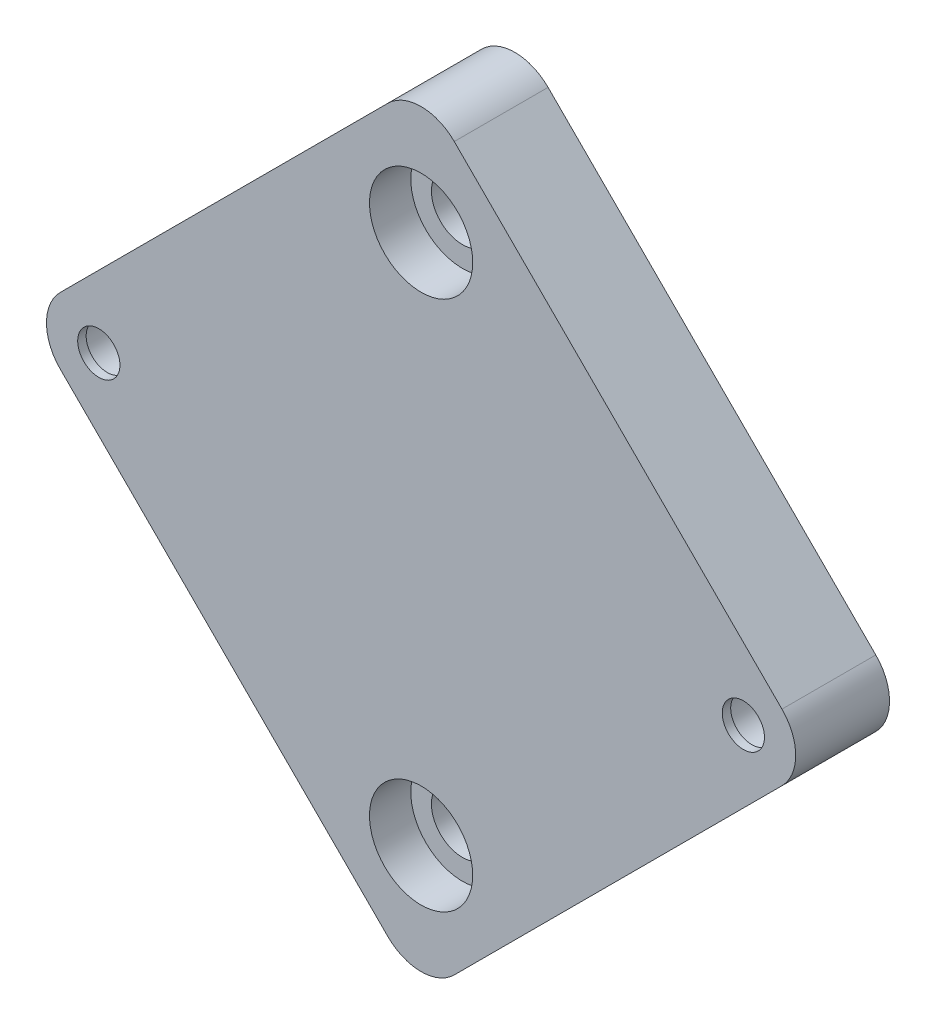
ISO-10303-21;
HEADER;
FILE_DESCRIPTION(('STEP AP214'),'2;1');
FILE_NAME('part.step','',(''),(''),'','','');
FILE_SCHEMA(('AUTOMOTIVE_DESIGN { 1 0 10303 214 1 1 1 1 }'));
ENDSEC;
DATA;
#1=APPLICATION_CONTEXT('core data for automotive mechanical design processes');
#2=APPLICATION_PROTOCOL_DEFINITION('international standard','automotive_design',2000,#1);
#3=PRODUCT_CONTEXT('',#1,'mechanical');
#4=PRODUCT('Part','Part','',(#3));
#5=PRODUCT_RELATED_PRODUCT_CATEGORY('part','',(#4));
#6=PRODUCT_DEFINITION_FORMATION('','',#4);
#7=PRODUCT_DEFINITION_CONTEXT('part definition',#1,'design');
#8=PRODUCT_DEFINITION('design','',#6,#7);
#9=PRODUCT_DEFINITION_SHAPE('','',#8);
#10=(LENGTH_UNIT() NAMED_UNIT(*) SI_UNIT(.MILLI.,.METRE.));
#11=(NAMED_UNIT(*) PLANE_ANGLE_UNIT() SI_UNIT($,.RADIAN.));
#12=(NAMED_UNIT(*) SI_UNIT($,.STERADIAN.) SOLID_ANGLE_UNIT());
#13=UNCERTAINTY_MEASURE_WITH_UNIT(LENGTH_MEASURE(1.E-05),#10,'distance_accuracy_value','');
#14=(GEOMETRIC_REPRESENTATION_CONTEXT(3) GLOBAL_UNCERTAINTY_ASSIGNED_CONTEXT((#13)) GLOBAL_UNIT_ASSIGNED_CONTEXT((#10,
#11,#12)) REPRESENTATION_CONTEXT('',''));
#15=CARTESIAN_POINT('',(0.,0.,0.));
#16=DIRECTION('',(0.,0.,1.));
#17=DIRECTION('',(1.,0.,0.));
#18=AXIS2_PLACEMENT_3D('',#15,#16,#17);
#19=CARTESIAN_POINT('',(0.,0.,10.));
#20=DIRECTION('',(0.,0.,1.));
#21=DIRECTION('',(1.,0.,0.));
#22=AXIS2_PLACEMENT_3D('',#19,#20,#21);
#23=PLANE('',#22);
#24=CARTESIAN_POINT('',(0.,28.2842712474619,10.));
#25=DIRECTION('',(0.,0.,1.));
#26=DIRECTION('',(1.,0.,0.));
#27=AXIS2_PLACEMENT_3D('',#24,#25,#26);
#28=CIRCLE('',#27,5.5);
#29=CARTESIAN_POINT('',(5.5,28.2842712474619,10.));
#30=VERTEX_POINT('',#29);
#31=EDGE_CURVE('E269',#30,#30,#28,.T.);
#32=ORIENTED_EDGE('',*,*,#31,.F.);
#33=EDGE_LOOP('',(#32));
#34=FACE_BOUND('',#33,.T.);
#35=CARTESIAN_POINT('',(0.,-28.2842712474619,10.));
#36=DIRECTION('',(0.,0.,1.));
#37=DIRECTION('',(1.,0.,0.));
#38=AXIS2_PLACEMENT_3D('',#35,#36,#37);
#39=CIRCLE('',#38,5.5);
#40=CARTESIAN_POINT('',(5.5,-28.2842712474619,10.));
#41=VERTEX_POINT('',#40);
#42=EDGE_CURVE('E253',#41,#41,#39,.T.);
#43=ORIENTED_EDGE('',*,*,#42,.F.);
#44=EDGE_LOOP('',(#43));
#45=FACE_BOUND('',#44,.T.);
#46=CARTESIAN_POINT('',(-34.35,0.,10.));
#47=DIRECTION('',(0.,0.,1.));
#48=DIRECTION('',(1.,0.,0.));
#49=AXIS2_PLACEMENT_3D('',#46,#47,#48);
#50=CIRCLE('',#49,2.25);
#51=CARTESIAN_POINT('',(-32.1,0.,10.));
#52=VERTEX_POINT('',#51);
#53=EDGE_CURVE('E142',#52,#52,#50,.T.);
#54=ORIENTED_EDGE('',*,*,#53,.F.);
#55=EDGE_LOOP('',(#54));
#56=FACE_BOUND('',#55,.T.);
#57=DIRECTION('',(0.707106781186547,-0.707106781186547,0.));
#58=VECTOR('',#57,1.);
#59=CARTESIAN_POINT('',(-42.,0.,10.));
#60=LINE('',#59,#58);
#61=CARTESIAN_POINT('',(-38.4644660940673,-3.53553390593274,10.));
#62=VERTEX_POINT('',#61);
#63=CARTESIAN_POINT('',(-3.53553390593276,-38.4644660940672,10.));
#64=VERTEX_POINT('',#63);
#65=EDGE_CURVE('E148',#62,#64,#60,.T.);
#66=ORIENTED_EDGE('',*,*,#65,.T.);
#67=CARTESIAN_POINT('',(0.,-34.9289321881345,10.));
#68=DIRECTION('',(0.,0.,1.));
#69=DIRECTION('',(1.,0.,0.));
#70=AXIS2_PLACEMENT_3D('',#67,#68,#69);
#71=CIRCLE('',#70,5.);
#72=CARTESIAN_POINT('',(3.53553390593273,-38.4644660940673,10.));
#73=VERTEX_POINT('',#72);
#74=EDGE_CURVE('E182',#64,#73,#71,.T.);
#75=ORIENTED_EDGE('',*,*,#74,.T.);
#76=DIRECTION('',(0.707106781186548,0.707106781186548,0.));
#77=VECTOR('',#76,1.);
#78=CARTESIAN_POINT('',(0.,-42.,10.));
#79=LINE('',#78,#77);
#80=CARTESIAN_POINT('',(38.4644660940673,-3.53553390593272,10.));
#81=VERTEX_POINT('',#80);
#82=EDGE_CURVE('E126',#73,#81,#79,.T.);
#83=ORIENTED_EDGE('',*,*,#82,.T.);
#84=CARTESIAN_POINT('',(34.9289321881345,0.,10.));
#85=DIRECTION('',(0.,0.,1.));
#86=DIRECTION('',(1.,0.,0.));
#87=AXIS2_PLACEMENT_3D('',#84,#85,#86);
#88=CIRCLE('',#87,5.);
#89=CARTESIAN_POINT('',(38.4644660940673,3.53553390593274,10.));
#90=VERTEX_POINT('',#89);
#91=EDGE_CURVE('E179',#81,#90,#88,.T.);
#92=ORIENTED_EDGE('',*,*,#91,.T.);
#93=DIRECTION('',(-0.707106781186548,0.707106781186548,0.));
#94=VECTOR('',#93,1.);
#95=CARTESIAN_POINT('',(0.,42.,10.));
#96=LINE('',#95,#94);
#97=CARTESIAN_POINT('',(3.53553390593274,38.4644660940673,10.));
#98=VERTEX_POINT('',#97);
#99=EDGE_CURVE('E208',#90,#98,#96,.T.);
#100=ORIENTED_EDGE('',*,*,#99,.T.);
#101=CARTESIAN_POINT('',(0.,34.9289321881345,10.));
#102=DIRECTION('',(0.,0.,1.));
#103=DIRECTION('',(1.,0.,0.));
#104=AXIS2_PLACEMENT_3D('',#101,#102,#103);
#105=CIRCLE('',#104,5.);
#106=CARTESIAN_POINT('',(-3.53553390593274,38.4644660940673,10.));
#107=VERTEX_POINT('',#106);
#108=EDGE_CURVE('E60',#98,#107,#105,.T.);
#109=ORIENTED_EDGE('',*,*,#108,.T.);
#110=DIRECTION('',(-0.707106781186548,-0.707106781186548,0.));
#111=VECTOR('',#110,1.);
#112=CARTESIAN_POINT('',(-42.,0.,10.));
#113=LINE('',#112,#111);
#114=CARTESIAN_POINT('',(-38.4644660940673,3.53553390593274,10.));
#115=VERTEX_POINT('',#114);
#116=EDGE_CURVE('E160',#107,#115,#113,.T.);
#117=ORIENTED_EDGE('',*,*,#116,.T.);
#118=CARTESIAN_POINT('',(-34.9289321881345,0.,10.));
#119=DIRECTION('',(0.,0.,1.));
#120=DIRECTION('',(1.,0.,0.));
#121=AXIS2_PLACEMENT_3D('',#118,#119,#120);
#122=CIRCLE('',#121,5.);
#123=EDGE_CURVE('E176',#115,#62,#122,.T.);
#124=ORIENTED_EDGE('',*,*,#123,.T.);
#125=EDGE_LOOP('',(#66,#75,#83,#92,#100,#109,#117,#124));
#126=FACE_BOUND('',#125,.T.);
#127=CARTESIAN_POINT('',(34.35,0.,10.));
#128=DIRECTION('',(0.,0.,1.));
#129=DIRECTION('',(1.,0.,0.));
#130=AXIS2_PLACEMENT_3D('',#127,#128,#129);
#131=CIRCLE('',#130,2.25);
#132=CARTESIAN_POINT('',(36.6,0.,10.));
#133=VERTEX_POINT('',#132);
#134=EDGE_CURVE('E158',#133,#133,#131,.T.);
#135=ORIENTED_EDGE('',*,*,#134,.F.);
#136=EDGE_LOOP('',(#135));
#137=FACE_BOUND('',#136,.T.);
#138=ADVANCED_FACE('F39',(#34,#45,#56,#126,#137),#23,.T.);
#139=CARTESIAN_POINT('',(0.,0.,0.));
#140=DIRECTION('',(0.,0.,1.));
#141=DIRECTION('',(1.,0.,0.));
#142=AXIS2_PLACEMENT_3D('',#139,#140,#141);
#143=PLANE('',#142);
#144=CARTESIAN_POINT('',(0.,28.2842712474619,0.));
#145=DIRECTION('',(0.,0.,1.));
#146=DIRECTION('',(1.,0.,0.));
#147=AXIS2_PLACEMENT_3D('',#144,#145,#146);
#148=CIRCLE('',#147,3.3);
#149=CARTESIAN_POINT('',(3.3,28.2842712474619,0.));
#150=VERTEX_POINT('',#149);
#151=EDGE_CURVE('E257',#150,#150,#148,.T.);
#152=ORIENTED_EDGE('',*,*,#151,.T.);
#153=EDGE_LOOP('',(#152));
#154=FACE_BOUND('',#153,.T.);
#155=CARTESIAN_POINT('',(0.,-28.2842712474619,0.));
#156=DIRECTION('',(0.,0.,1.));
#157=DIRECTION('',(1.,0.,0.));
#158=AXIS2_PLACEMENT_3D('',#155,#156,#157);
#159=CIRCLE('',#158,3.3);
#160=CARTESIAN_POINT('',(3.3,-28.2842712474619,0.));
#161=VERTEX_POINT('',#160);
#162=EDGE_CURVE('E231',#161,#161,#159,.T.);
#163=ORIENTED_EDGE('',*,*,#162,.T.);
#164=EDGE_LOOP('',(#163));
#165=FACE_BOUND('',#164,.T.);
#166=CARTESIAN_POINT('',(34.35,0.,0.));
#167=DIRECTION('',(0.,0.,1.));
#168=DIRECTION('',(1.,0.,0.));
#169=AXIS2_PLACEMENT_3D('',#166,#167,#168);
#170=CIRCLE('',#169,2.8);
#171=CARTESIAN_POINT('',(37.15,0.,0.));
#172=VERTEX_POINT('',#171);
#173=EDGE_CURVE('E235',#172,#172,#170,.T.);
#174=ORIENTED_EDGE('',*,*,#173,.T.);
#175=EDGE_LOOP('',(#174));
#176=FACE_BOUND('',#175,.T.);
#177=CARTESIAN_POINT('',(-34.35,0.,0.));
#178=DIRECTION('',(0.,0.,1.));
#179=DIRECTION('',(1.,0.,0.));
#180=AXIS2_PLACEMENT_3D('',#177,#178,#179);
#181=CIRCLE('',#180,2.8);
#182=CARTESIAN_POINT('',(-31.55,0.,0.));
#183=VERTEX_POINT('',#182);
#184=EDGE_CURVE('E226',#183,#183,#181,.T.);
#185=ORIENTED_EDGE('',*,*,#184,.T.);
#186=EDGE_LOOP('',(#185));
#187=FACE_BOUND('',#186,.T.);
#188=DIRECTION('',(0.707106781186548,0.707106781186548,0.));
#189=VECTOR('',#188,1.);
#190=CARTESIAN_POINT('',(0.,-42.,0.));
#191=LINE('',#190,#189);
#192=CARTESIAN_POINT('',(3.53553390593273,-38.4644660940673,0.));
#193=VERTEX_POINT('',#192);
#194=CARTESIAN_POINT('',(38.4644660940673,-3.53553390593272,0.));
#195=VERTEX_POINT('',#194);
#196=EDGE_CURVE('E123',#193,#195,#191,.T.);
#197=ORIENTED_EDGE('',*,*,#196,.F.);
#198=CARTESIAN_POINT('',(0.,-34.9289321881345,0.));
#199=DIRECTION('',(0.,0.,1.));
#200=DIRECTION('',(1.,0.,0.));
#201=AXIS2_PLACEMENT_3D('',#198,#199,#200);
#202=CIRCLE('',#201,5.);
#203=CARTESIAN_POINT('',(-3.53553390593276,-38.4644660940672,0.));
#204=VERTEX_POINT('',#203);
#205=EDGE_CURVE('E105',#193,#204,#202,.F.);
#206=ORIENTED_EDGE('',*,*,#205,.T.);
#207=DIRECTION('',(0.707106781186547,-0.707106781186547,0.));
#208=VECTOR('',#207,1.);
#209=CARTESIAN_POINT('',(-42.,0.,0.));
#210=LINE('',#209,#208);
#211=CARTESIAN_POINT('',(-38.4644660940673,-3.53553390593274,0.));
#212=VERTEX_POINT('',#211);
#213=EDGE_CURVE('E135',#212,#204,#210,.T.);
#214=ORIENTED_EDGE('',*,*,#213,.F.);
#215=CARTESIAN_POINT('',(-34.9289321881345,0.,0.));
#216=DIRECTION('',(0.,0.,1.));
#217=DIRECTION('',(1.,0.,0.));
#218=AXIS2_PLACEMENT_3D('',#215,#216,#217);
#219=CIRCLE('',#218,5.);
#220=CARTESIAN_POINT('',(-38.4644660940673,3.53553390593274,0.));
#221=VERTEX_POINT('',#220);
#222=EDGE_CURVE('E164',#212,#221,#219,.F.);
#223=ORIENTED_EDGE('',*,*,#222,.T.);
#224=DIRECTION('',(-0.707106781186548,-0.707106781186548,0.));
#225=VECTOR('',#224,1.);
#226=CARTESIAN_POINT('',(-42.,0.,0.));
#227=LINE('',#226,#225);
#228=CARTESIAN_POINT('',(-3.53553390593274,38.4644660940673,0.));
#229=VERTEX_POINT('',#228);
#230=EDGE_CURVE('E140',#229,#221,#227,.T.);
#231=ORIENTED_EDGE('',*,*,#230,.F.);
#232=CARTESIAN_POINT('',(0.,34.9289321881345,0.));
#233=DIRECTION('',(0.,0.,1.));
#234=DIRECTION('',(1.,0.,0.));
#235=AXIS2_PLACEMENT_3D('',#232,#233,#234);
#236=CIRCLE('',#235,5.);
#237=CARTESIAN_POINT('',(3.53553390593274,38.4644660940673,0.));
#238=VERTEX_POINT('',#237);
#239=EDGE_CURVE('E128',#229,#238,#236,.F.);
#240=ORIENTED_EDGE('',*,*,#239,.T.);
#241=DIRECTION('',(-0.707106781186548,0.707106781186548,0.));
#242=VECTOR('',#241,1.);
#243=CARTESIAN_POINT('',(0.,42.,0.));
#244=LINE('',#243,#242);
#245=CARTESIAN_POINT('',(38.4644660940673,3.53553390593274,0.));
#246=VERTEX_POINT('',#245);
#247=EDGE_CURVE('E134',#246,#238,#244,.T.);
#248=ORIENTED_EDGE('',*,*,#247,.F.);
#249=CARTESIAN_POINT('',(34.9289321881345,0.,0.));
#250=DIRECTION('',(0.,0.,1.));
#251=DIRECTION('',(1.,0.,0.));
#252=AXIS2_PLACEMENT_3D('',#249,#250,#251);
#253=CIRCLE('',#252,5.);
#254=EDGE_CURVE('E117',#246,#195,#253,.F.);
#255=ORIENTED_EDGE('',*,*,#254,.T.);
#256=EDGE_LOOP('',(#197,#206,#214,#223,#231,#240,#248,#255));
#257=FACE_BOUND('',#256,.T.);
#258=ADVANCED_FACE('F131',(#154,#165,#176,#187,#257),#143,.F.);
#259=CARTESIAN_POINT('',(-42.,0.,10.));
#260=DIRECTION('',(0.707106781186548,0.707106781186548,0.));
#261=DIRECTION('',(-0.707106781186548,0.707106781186548,0.));
#262=AXIS2_PLACEMENT_3D('',#259,#260,#261);
#263=PLANE('',#262);
#264=ORIENTED_EDGE('',*,*,#213,.T.);
#265=DIRECTION('',(0.,0.,-1.));
#266=VECTOR('',#265,1.);
#267=CARTESIAN_POINT('',(-3.53553390593276,-38.4644660940672,10.));
#268=LINE('',#267,#266);
#269=EDGE_CURVE('E110',#204,#64,#268,.F.);
#270=ORIENTED_EDGE('',*,*,#269,.T.);
#271=ORIENTED_EDGE('',*,*,#65,.F.);
#272=DIRECTION('',(0.,0.,-1.));
#273=VECTOR('',#272,1.);
#274=CARTESIAN_POINT('',(-38.4644660940673,-3.53553390593274,10.));
#275=LINE('',#274,#273);
#276=EDGE_CURVE('E116',#62,#212,#275,.T.);
#277=ORIENTED_EDGE('',*,*,#276,.T.);
#278=EDGE_LOOP('',(#264,#270,#271,#277));
#279=FACE_BOUND('',#278,.T.);
#280=ADVANCED_FACE('F203',(#279),#263,.F.);
#281=CARTESIAN_POINT('',(0.,-42.,10.));
#282=DIRECTION('',(-0.707106781186548,0.707106781186548,0.));
#283=DIRECTION('',(-0.707106781186548,-0.707106781186548,0.));
#284=AXIS2_PLACEMENT_3D('',#281,#282,#283);
#285=PLANE('',#284);
#286=ORIENTED_EDGE('',*,*,#82,.F.);
#287=DIRECTION('',(0.,0.,-1.));
#288=VECTOR('',#287,1.);
#289=CARTESIAN_POINT('',(3.53553390593273,-38.4644660940673,10.));
#290=LINE('',#289,#288);
#291=EDGE_CURVE('E109',#73,#193,#290,.T.);
#292=ORIENTED_EDGE('',*,*,#291,.T.);
#293=ORIENTED_EDGE('',*,*,#196,.T.);
#294=DIRECTION('',(0.,0.,-1.));
#295=VECTOR('',#294,1.);
#296=CARTESIAN_POINT('',(38.4644660940672,-3.53553390593273,10.));
#297=LINE('',#296,#295);
#298=EDGE_CURVE('E129',#195,#81,#297,.F.);
#299=ORIENTED_EDGE('',*,*,#298,.T.);
#300=EDGE_LOOP('',(#286,#292,#293,#299));
#301=FACE_BOUND('',#300,.T.);
#302=ADVANCED_FACE('F122',(#301),#285,.F.);
#303=CARTESIAN_POINT('',(0.,42.,10.));
#304=DIRECTION('',(-0.707106781186548,-0.707106781186548,0.));
#305=DIRECTION('',(0.707106781186548,-0.707106781186548,0.));
#306=AXIS2_PLACEMENT_3D('',#303,#304,#305);
#307=PLANE('',#306);
#308=ORIENTED_EDGE('',*,*,#99,.F.);
#309=DIRECTION('',(0.,0.,-1.));
#310=VECTOR('',#309,1.);
#311=CARTESIAN_POINT('',(38.4644660940672,3.53553390593275,10.));
#312=LINE('',#311,#310);
#313=EDGE_CURVE('E188',#90,#246,#312,.T.);
#314=ORIENTED_EDGE('',*,*,#313,.T.);
#315=ORIENTED_EDGE('',*,*,#247,.T.);
#316=DIRECTION('',(0.,0.,-1.));
#317=VECTOR('',#316,1.);
#318=CARTESIAN_POINT('',(3.53553390593274,38.4644660940673,10.));
#319=LINE('',#318,#317);
#320=EDGE_CURVE('E185',#238,#98,#319,.F.);
#321=ORIENTED_EDGE('',*,*,#320,.T.);
#322=EDGE_LOOP('',(#308,#314,#315,#321));
#323=FACE_BOUND('',#322,.T.);
#324=ADVANCED_FACE('F292',(#323),#307,.F.);
#325=CARTESIAN_POINT('',(-42.,0.,10.));
#326=DIRECTION('',(0.707106781186548,-0.707106781186548,0.));
#327=DIRECTION('',(0.707106781186548,0.707106781186548,0.));
#328=AXIS2_PLACEMENT_3D('',#325,#326,#327);
#329=PLANE('',#328);
#330=ORIENTED_EDGE('',*,*,#230,.T.);
#331=DIRECTION('',(0.,0.,-1.));
#332=VECTOR('',#331,1.);
#333=CARTESIAN_POINT('',(-38.4644660940673,3.53553390593274,10.));
#334=LINE('',#333,#332);
#335=EDGE_CURVE('E11',#221,#115,#334,.F.);
#336=ORIENTED_EDGE('',*,*,#335,.T.);
#337=ORIENTED_EDGE('',*,*,#116,.F.);
#338=DIRECTION('',(0.,0.,-1.));
#339=VECTOR('',#338,1.);
#340=CARTESIAN_POINT('',(-3.53553390593275,38.4644660940673,10.));
#341=LINE('',#340,#339);
#342=EDGE_CURVE('E48',#107,#229,#341,.T.);
#343=ORIENTED_EDGE('',*,*,#342,.T.);
#344=EDGE_LOOP('',(#330,#336,#337,#343));
#345=FACE_BOUND('',#344,.T.);
#346=ADVANCED_FACE('F195',(#345),#329,.F.);
#347=CARTESIAN_POINT('',(-34.35,0.,10.));
#348=DIRECTION('',(0.,0.,-1.));
#349=DIRECTION('',(-1.,0.,0.));
#350=AXIS2_PLACEMENT_3D('',#347,#348,#349);
#351=CYLINDRICAL_SURFACE('',#350,2.25);
#352=CARTESIAN_POINT('',(-34.35,0.,9.1));
#353=DIRECTION('',(0.,0.,1.));
#354=DIRECTION('',(1.,0.,0.));
#355=AXIS2_PLACEMENT_3D('',#352,#353,#354);
#356=CIRCLE('',#355,2.25);
#357=CARTESIAN_POINT('',(-32.1,0.,9.1));
#358=VERTEX_POINT('',#357);
#359=EDGE_CURVE('E153',#358,#358,#356,.T.);
#360=ORIENTED_EDGE('',*,*,#359,.F.);
#361=EDGE_LOOP('',(#360));
#362=FACE_BOUND('',#361,.T.);
#363=ORIENTED_EDGE('',*,*,#53,.T.);
#364=EDGE_LOOP('',(#363));
#365=FACE_BOUND('',#364,.T.);
#366=ADVANCED_FACE('F280',(#362,#365),#351,.F.);
#367=CARTESIAN_POINT('',(34.35,0.,10.));
#368=DIRECTION('',(0.,0.,-1.));
#369=DIRECTION('',(-1.,0.,0.));
#370=AXIS2_PLACEMENT_3D('',#367,#368,#369);
#371=CYLINDRICAL_SURFACE('',#370,2.25);
#372=CARTESIAN_POINT('',(34.35,0.,9.1));
#373=DIRECTION('',(0.,0.,1.));
#374=DIRECTION('',(1.,0.,0.));
#375=AXIS2_PLACEMENT_3D('',#372,#373,#374);
#376=CIRCLE('',#375,2.25);
#377=CARTESIAN_POINT('',(36.6,0.,9.1));
#378=VERTEX_POINT('',#377);
#379=EDGE_CURVE('E149',#378,#378,#376,.T.);
#380=ORIENTED_EDGE('',*,*,#379,.F.);
#381=EDGE_LOOP('',(#380));
#382=FACE_BOUND('',#381,.T.);
#383=ORIENTED_EDGE('',*,*,#134,.T.);
#384=EDGE_LOOP('',(#383));
#385=FACE_BOUND('',#384,.T.);
#386=ADVANCED_FACE('F282',(#382,#385),#371,.F.);
#387=CARTESIAN_POINT('',(34.35,0.,9.1));
#388=DIRECTION('',(0.,0.,-1.));
#389=DIRECTION('',(-1.,0.,0.));
#390=AXIS2_PLACEMENT_3D('',#387,#388,#389);
#391=CYLINDRICAL_SURFACE('',#390,2.8);
#392=CARTESIAN_POINT('',(34.35,0.,9.1));
#393=DIRECTION('',(0.,0.,1.));
#394=DIRECTION('',(1.,0.,0.));
#395=AXIS2_PLACEMENT_3D('',#392,#393,#394);
#396=CIRCLE('',#395,2.8);
#397=CARTESIAN_POINT('',(37.15,0.,9.1));
#398=VERTEX_POINT('',#397);
#399=EDGE_CURVE('E154',#398,#398,#396,.T.);
#400=ORIENTED_EDGE('',*,*,#399,.T.);
#401=EDGE_LOOP('',(#400));
#402=FACE_BOUND('',#401,.T.);
#403=ORIENTED_EDGE('',*,*,#173,.F.);
#404=EDGE_LOOP('',(#403));
#405=FACE_BOUND('',#404,.T.);
#406=ADVANCED_FACE('F289',(#402,#405),#391,.F.);
#407=CARTESIAN_POINT('',(34.35,0.,9.1));
#408=DIRECTION('',(0.,0.,1.));
#409=DIRECTION('',(1.,0.,0.));
#410=AXIS2_PLACEMENT_3D('',#407,#408,#409);
#411=PLANE('',#410);
#412=ORIENTED_EDGE('',*,*,#379,.T.);
#413=EDGE_LOOP('',(#412));
#414=FACE_BOUND('',#413,.T.);
#415=ORIENTED_EDGE('',*,*,#399,.F.);
#416=EDGE_LOOP('',(#415));
#417=FACE_BOUND('',#416,.T.);
#418=ADVANCED_FACE('F454',(#414,#417),#411,.F.);
#419=CARTESIAN_POINT('',(-34.35,0.,9.1));
#420=DIRECTION('',(0.,0.,-1.));
#421=DIRECTION('',(-1.,0.,0.));
#422=AXIS2_PLACEMENT_3D('',#419,#420,#421);
#423=CYLINDRICAL_SURFACE('',#422,2.8);
#424=CARTESIAN_POINT('',(-34.35,0.,9.1));
#425=DIRECTION('',(0.,0.,1.));
#426=DIRECTION('',(1.,0.,0.));
#427=AXIS2_PLACEMENT_3D('',#424,#425,#426);
#428=CIRCLE('',#427,2.8);
#429=CARTESIAN_POINT('',(-31.55,0.,9.1));
#430=VERTEX_POINT('',#429);
#431=EDGE_CURVE('E230',#430,#430,#428,.T.);
#432=ORIENTED_EDGE('',*,*,#431,.T.);
#433=EDGE_LOOP('',(#432));
#434=FACE_BOUND('',#433,.T.);
#435=ORIENTED_EDGE('',*,*,#184,.F.);
#436=EDGE_LOOP('',(#435));
#437=FACE_BOUND('',#436,.T.);
#438=ADVANCED_FACE('F444',(#434,#437),#423,.F.);
#439=CARTESIAN_POINT('',(-34.35,0.,9.1));
#440=DIRECTION('',(0.,0.,1.));
#441=DIRECTION('',(1.,0.,0.));
#442=AXIS2_PLACEMENT_3D('',#439,#440,#441);
#443=PLANE('',#442);
#444=ORIENTED_EDGE('',*,*,#359,.T.);
#445=EDGE_LOOP('',(#444));
#446=FACE_BOUND('',#445,.T.);
#447=ORIENTED_EDGE('',*,*,#431,.F.);
#448=EDGE_LOOP('',(#447));
#449=FACE_BOUND('',#448,.T.);
#450=ADVANCED_FACE('F434',(#446,#449),#443,.F.);
#451=CARTESIAN_POINT('',(0.,-28.2842712474619,10.));
#452=DIRECTION('',(0.,0.,1.));
#453=DIRECTION('',(1.,0.,0.));
#454=AXIS2_PLACEMENT_3D('',#451,#452,#453);
#455=CYLINDRICAL_SURFACE('',#454,3.3);
#456=ORIENTED_EDGE('',*,*,#162,.F.);
#457=EDGE_LOOP('',(#456));
#458=FACE_BOUND('',#457,.T.);
#459=CARTESIAN_POINT('',(0.,-28.2842712474619,5.6));
#460=DIRECTION('',(0.,0.,1.));
#461=DIRECTION('',(1.,0.,0.));
#462=AXIS2_PLACEMENT_3D('',#459,#460,#461);
#463=CIRCLE('',#462,3.3);
#464=CARTESIAN_POINT('',(3.3,-28.2842712474619,5.6));
#465=VERTEX_POINT('',#464);
#466=EDGE_CURVE('E245',#465,#465,#463,.T.);
#467=ORIENTED_EDGE('',*,*,#466,.T.);
#468=EDGE_LOOP('',(#467));
#469=FACE_BOUND('',#468,.T.);
#470=ADVANCED_FACE('F424',(#458,#469),#455,.F.);
#471=CARTESIAN_POINT('',(3.3,-28.2842712474619,5.6));
#472=DIRECTION('',(0.,0.,-1.));
#473=DIRECTION('',(-1.,0.,0.));
#474=AXIS2_PLACEMENT_3D('',#471,#472,#473);
#475=PLANE('',#474);
#476=ORIENTED_EDGE('',*,*,#466,.F.);
#477=EDGE_LOOP('',(#476));
#478=FACE_BOUND('',#477,.T.);
#479=CARTESIAN_POINT('',(0.,-28.2842712474619,5.6));
#480=DIRECTION('',(0.,0.,1.));
#481=DIRECTION('',(1.,0.,0.));
#482=AXIS2_PLACEMENT_3D('',#479,#480,#481);
#483=CIRCLE('',#482,5.5);
#484=CARTESIAN_POINT('',(5.5,-28.2842712474619,5.6));
#485=VERTEX_POINT('',#484);
#486=EDGE_CURVE('E249',#485,#485,#483,.T.);
#487=ORIENTED_EDGE('',*,*,#486,.T.);
#488=EDGE_LOOP('',(#487));
#489=FACE_BOUND('',#488,.T.);
#490=ADVANCED_FACE('F414',(#478,#489),#475,.F.);
#491=CARTESIAN_POINT('',(0.,-28.2842712474619,10.));
#492=DIRECTION('',(0.,0.,1.));
#493=DIRECTION('',(1.,0.,0.));
#494=AXIS2_PLACEMENT_3D('',#491,#492,#493);
#495=CYLINDRICAL_SURFACE('',#494,5.5);
#496=ORIENTED_EDGE('',*,*,#486,.F.);
#497=EDGE_LOOP('',(#496));
#498=FACE_BOUND('',#497,.T.);
#499=ORIENTED_EDGE('',*,*,#42,.T.);
#500=EDGE_LOOP('',(#499));
#501=FACE_BOUND('',#500,.T.);
#502=ADVANCED_FACE('F404',(#498,#501),#495,.F.);
#503=CARTESIAN_POINT('',(0.,28.2842712474619,10.));
#504=DIRECTION('',(0.,0.,1.));
#505=DIRECTION('',(1.,0.,0.));
#506=AXIS2_PLACEMENT_3D('',#503,#504,#505);
#507=CYLINDRICAL_SURFACE('',#506,3.3);
#508=ORIENTED_EDGE('',*,*,#151,.F.);
#509=EDGE_LOOP('',(#508));
#510=FACE_BOUND('',#509,.T.);
#511=CARTESIAN_POINT('',(0.,28.2842712474619,5.6));
#512=DIRECTION('',(0.,0.,1.));
#513=DIRECTION('',(1.,0.,0.));
#514=AXIS2_PLACEMENT_3D('',#511,#512,#513);
#515=CIRCLE('',#514,3.3);
#516=CARTESIAN_POINT('',(3.3,28.2842712474619,5.6));
#517=VERTEX_POINT('',#516);
#518=EDGE_CURVE('E261',#517,#517,#515,.T.);
#519=ORIENTED_EDGE('',*,*,#518,.T.);
#520=EDGE_LOOP('',(#519));
#521=FACE_BOUND('',#520,.T.);
#522=ADVANCED_FACE('F394',(#510,#521),#507,.F.);
#523=CARTESIAN_POINT('',(3.3,28.2842712474619,5.6));
#524=DIRECTION('',(0.,0.,-1.));
#525=DIRECTION('',(-1.,0.,0.));
#526=AXIS2_PLACEMENT_3D('',#523,#524,#525);
#527=PLANE('',#526);
#528=ORIENTED_EDGE('',*,*,#518,.F.);
#529=EDGE_LOOP('',(#528));
#530=FACE_BOUND('',#529,.T.);
#531=CARTESIAN_POINT('',(0.,28.2842712474619,5.6));
#532=DIRECTION('',(0.,0.,1.));
#533=DIRECTION('',(1.,0.,0.));
#534=AXIS2_PLACEMENT_3D('',#531,#532,#533);
#535=CIRCLE('',#534,5.5);
#536=CARTESIAN_POINT('',(5.5,28.2842712474619,5.6));
#537=VERTEX_POINT('',#536);
#538=EDGE_CURVE('E265',#537,#537,#535,.T.);
#539=ORIENTED_EDGE('',*,*,#538,.T.);
#540=EDGE_LOOP('',(#539));
#541=FACE_BOUND('',#540,.T.);
#542=ADVANCED_FACE('F384',(#530,#541),#527,.F.);
#543=CARTESIAN_POINT('',(0.,28.2842712474619,10.));
#544=DIRECTION('',(0.,0.,1.));
#545=DIRECTION('',(1.,0.,0.));
#546=AXIS2_PLACEMENT_3D('',#543,#544,#545);
#547=CYLINDRICAL_SURFACE('',#546,5.5);
#548=ORIENTED_EDGE('',*,*,#538,.F.);
#549=EDGE_LOOP('',(#548));
#550=FACE_BOUND('',#549,.T.);
#551=ORIENTED_EDGE('',*,*,#31,.T.);
#552=EDGE_LOOP('',(#551));
#553=FACE_BOUND('',#552,.T.);
#554=ADVANCED_FACE('F274',(#550,#553),#547,.F.);
#555=CARTESIAN_POINT('',(0.,-34.9289321881345,10.));
#556=DIRECTION('',(0.,0.,-1.));
#557=DIRECTION('',(-1.,0.,0.));
#558=AXIS2_PLACEMENT_3D('',#555,#556,#557);
#559=CYLINDRICAL_SURFACE('',#558,5.);
#560=ORIENTED_EDGE('',*,*,#74,.F.);
#561=ORIENTED_EDGE('',*,*,#269,.F.);
#562=ORIENTED_EDGE('',*,*,#205,.F.);
#563=ORIENTED_EDGE('',*,*,#291,.F.);
#564=EDGE_LOOP('',(#560,#561,#562,#563));
#565=FACE_BOUND('',#564,.T.);
#566=ADVANCED_FACE('F108',(#565),#559,.T.);
#567=CARTESIAN_POINT('',(34.9289321881345,0.,10.));
#568=DIRECTION('',(0.,0.,-1.));
#569=DIRECTION('',(-1.,0.,0.));
#570=AXIS2_PLACEMENT_3D('',#567,#568,#569);
#571=CYLINDRICAL_SURFACE('',#570,5.);
#572=ORIENTED_EDGE('',*,*,#91,.F.);
#573=ORIENTED_EDGE('',*,*,#298,.F.);
#574=ORIENTED_EDGE('',*,*,#254,.F.);
#575=ORIENTED_EDGE('',*,*,#313,.F.);
#576=EDGE_LOOP('',(#572,#573,#574,#575));
#577=FACE_BOUND('',#576,.T.);
#578=ADVANCED_FACE('F309',(#577),#571,.T.);
#579=CARTESIAN_POINT('',(-34.9289321881345,0.,10.));
#580=DIRECTION('',(0.,0.,-1.));
#581=DIRECTION('',(-1.,0.,0.));
#582=AXIS2_PLACEMENT_3D('',#579,#580,#581);
#583=CYLINDRICAL_SURFACE('',#582,5.);
#584=ORIENTED_EDGE('',*,*,#123,.F.);
#585=ORIENTED_EDGE('',*,*,#335,.F.);
#586=ORIENTED_EDGE('',*,*,#222,.F.);
#587=ORIENTED_EDGE('',*,*,#276,.F.);
#588=EDGE_LOOP('',(#584,#585,#586,#587));
#589=FACE_BOUND('',#588,.T.);
#590=ADVANCED_FACE('F200',(#589),#583,.T.);
#591=CARTESIAN_POINT('',(0.,34.9289321881345,10.));
#592=DIRECTION('',(0.,0.,-1.));
#593=DIRECTION('',(-1.,0.,0.));
#594=AXIS2_PLACEMENT_3D('',#591,#592,#593);
#595=CYLINDRICAL_SURFACE('',#594,5.);
#596=ORIENTED_EDGE('',*,*,#108,.F.);
#597=ORIENTED_EDGE('',*,*,#320,.F.);
#598=ORIENTED_EDGE('',*,*,#239,.F.);
#599=ORIENTED_EDGE('',*,*,#342,.F.);
#600=EDGE_LOOP('',(#596,#597,#598,#599));
#601=FACE_BOUND('',#600,.T.);
#602=ADVANCED_FACE('F41',(#601),#595,.T.);
#603=CLOSED_SHELL('',(#138,#258,#280,#302,#324,#346,#366,#386,#406,#418,#438,#450,#470,#490,
#502,#522,#542,#554,#566,#578,#590,#602));
#604=MANIFOLD_SOLID_BREP('B2',#603);
#605=ADVANCED_BREP_SHAPE_REPRESENTATION('',(#18,#604),#14);
#606=SHAPE_DEFINITION_REPRESENTATION(#9,#605);
ENDSEC;
END-ISO-10303-21;
